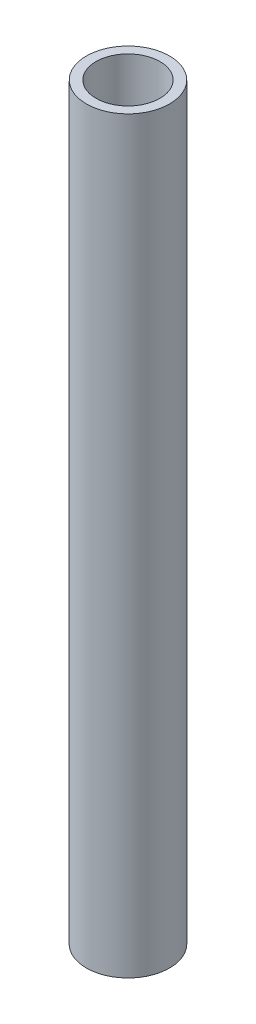
ISO-10303-21;
HEADER;
FILE_DESCRIPTION(('STEP AP214'),'2;1');
FILE_NAME('part.step','',(''),(''),'','','');
FILE_SCHEMA(('AUTOMOTIVE_DESIGN { 1 0 10303 214 1 1 1 1 }'));
ENDSEC;
DATA;
#1=APPLICATION_CONTEXT('core data for automotive mechanical design processes');
#2=APPLICATION_PROTOCOL_DEFINITION('international standard','automotive_design',2000,#1);
#3=PRODUCT_CONTEXT('',#1,'mechanical');
#4=PRODUCT('Part','Part','',(#3));
#5=PRODUCT_RELATED_PRODUCT_CATEGORY('part','',(#4));
#6=PRODUCT_DEFINITION_FORMATION('','',#4);
#7=PRODUCT_DEFINITION_CONTEXT('part definition',#1,'design');
#8=PRODUCT_DEFINITION('design','',#6,#7);
#9=PRODUCT_DEFINITION_SHAPE('','',#8);
#10=(LENGTH_UNIT() NAMED_UNIT(*) SI_UNIT(.MILLI.,.METRE.));
#11=(NAMED_UNIT(*) PLANE_ANGLE_UNIT() SI_UNIT($,.RADIAN.));
#12=(NAMED_UNIT(*) SI_UNIT($,.STERADIAN.) SOLID_ANGLE_UNIT());
#13=UNCERTAINTY_MEASURE_WITH_UNIT(LENGTH_MEASURE(1.E-05),#10,'distance_accuracy_value','');
#14=(GEOMETRIC_REPRESENTATION_CONTEXT(3) GLOBAL_UNCERTAINTY_ASSIGNED_CONTEXT((#13)) GLOBAL_UNIT_ASSIGNED_CONTEXT((#10,
#11,#12)) REPRESENTATION_CONTEXT('',''));
#15=CARTESIAN_POINT('',(0.,0.,0.));
#16=DIRECTION('',(0.,0.,1.));
#17=DIRECTION('',(1.,0.,0.));
#18=AXIS2_PLACEMENT_3D('',#15,#16,#17);
#19=CARTESIAN_POINT('',(0.,114.3,0.));
#20=DIRECTION('',(0.,1.,0.));
#21=DIRECTION('',(0.,0.,1.));
#22=AXIS2_PLACEMENT_3D('',#19,#20,#21);
#23=PLANE('',#22);
#24=CARTESIAN_POINT('',(0.,114.3,0.));
#25=DIRECTION('',(0.,1.,0.));
#26=DIRECTION('',(0.,0.,1.));
#27=AXIS2_PLACEMENT_3D('',#24,#25,#26);
#28=CIRCLE('',#27,6.35);
#29=CARTESIAN_POINT('',(0.,114.3,6.35));
#30=VERTEX_POINT('',#29);
#31=EDGE_CURVE('E12',#30,#30,#28,.T.);
#32=ORIENTED_EDGE('',*,*,#31,.T.);
#33=EDGE_LOOP('',(#32));
#34=FACE_BOUND('',#33,.T.);
#35=CARTESIAN_POINT('',(0.,114.3,0.));
#36=DIRECTION('',(0.,1.,0.));
#37=DIRECTION('',(0.,0.,1.));
#38=AXIS2_PLACEMENT_3D('',#35,#36,#37);
#39=CIRCLE('',#38,4.8768);
#40=CARTESIAN_POINT('',(0.,114.3,4.8768));
#41=VERTEX_POINT('',#40);
#42=EDGE_CURVE('E60',#41,#41,#39,.T.);
#43=ORIENTED_EDGE('',*,*,#42,.F.);
#44=EDGE_LOOP('',(#43));
#45=FACE_BOUND('',#44,.T.);
#46=ADVANCED_FACE('F46',(#34,#45),#23,.T.);
#47=CARTESIAN_POINT('',(0.,0.,0.));
#48=DIRECTION('',(0.,1.,0.));
#49=DIRECTION('',(0.,0.,1.));
#50=AXIS2_PLACEMENT_3D('',#47,#48,#49);
#51=PLANE('',#50);
#52=CARTESIAN_POINT('',(0.,0.,0.));
#53=DIRECTION('',(0.,1.,0.));
#54=DIRECTION('',(0.,0.,1.));
#55=AXIS2_PLACEMENT_3D('',#52,#53,#54);
#56=CIRCLE('',#55,6.35);
#57=CARTESIAN_POINT('',(0.,0.,6.35));
#58=VERTEX_POINT('',#57);
#59=EDGE_CURVE('E50',#58,#58,#56,.T.);
#60=ORIENTED_EDGE('',*,*,#59,.F.);
#61=EDGE_LOOP('',(#60));
#62=FACE_BOUND('',#61,.T.);
#63=CARTESIAN_POINT('',(0.,0.,0.));
#64=DIRECTION('',(0.,1.,0.));
#65=DIRECTION('',(0.,0.,1.));
#66=AXIS2_PLACEMENT_3D('',#63,#64,#65);
#67=CIRCLE('',#66,4.8768);
#68=CARTESIAN_POINT('',(0.,0.,4.8768));
#69=VERTEX_POINT('',#68);
#70=EDGE_CURVE('E62',#69,#69,#67,.T.);
#71=ORIENTED_EDGE('',*,*,#70,.T.);
#72=EDGE_LOOP('',(#71));
#73=FACE_BOUND('',#72,.T.);
#74=ADVANCED_FACE('F75',(#62,#73),#51,.F.);
#75=CARTESIAN_POINT('',(0.,114.3,0.));
#76=DIRECTION('',(0.,-1.,0.));
#77=DIRECTION('',(0.,0.,-1.));
#78=AXIS2_PLACEMENT_3D('',#75,#76,#77);
#79=CYLINDRICAL_SURFACE('',#78,6.35);
#80=ORIENTED_EDGE('',*,*,#31,.F.);
#81=EDGE_LOOP('',(#80));
#82=FACE_BOUND('',#81,.T.);
#83=ORIENTED_EDGE('',*,*,#59,.T.);
#84=EDGE_LOOP('',(#83));
#85=FACE_BOUND('',#84,.T.);
#86=ADVANCED_FACE('F48',(#82,#85),#79,.T.);
#87=CARTESIAN_POINT('',(0.,114.3,0.));
#88=DIRECTION('',(0.,-1.,0.));
#89=DIRECTION('',(0.,0.,-1.));
#90=AXIS2_PLACEMENT_3D('',#87,#88,#89);
#91=CYLINDRICAL_SURFACE('',#90,4.8768);
#92=ORIENTED_EDGE('',*,*,#42,.T.);
#93=EDGE_LOOP('',(#92));
#94=FACE_BOUND('',#93,.T.);
#95=ORIENTED_EDGE('',*,*,#70,.F.);
#96=EDGE_LOOP('',(#95));
#97=FACE_BOUND('',#96,.T.);
#98=ADVANCED_FACE('F71',(#94,#97),#91,.F.);
#99=CLOSED_SHELL('',(#46,#74,#86,#98));
#100=MANIFOLD_SOLID_BREP('B2',#99);
#101=ADVANCED_BREP_SHAPE_REPRESENTATION('',(#18,#100),#14);
#102=SHAPE_DEFINITION_REPRESENTATION(#9,#101);
ENDSEC;
END-ISO-10303-21;
